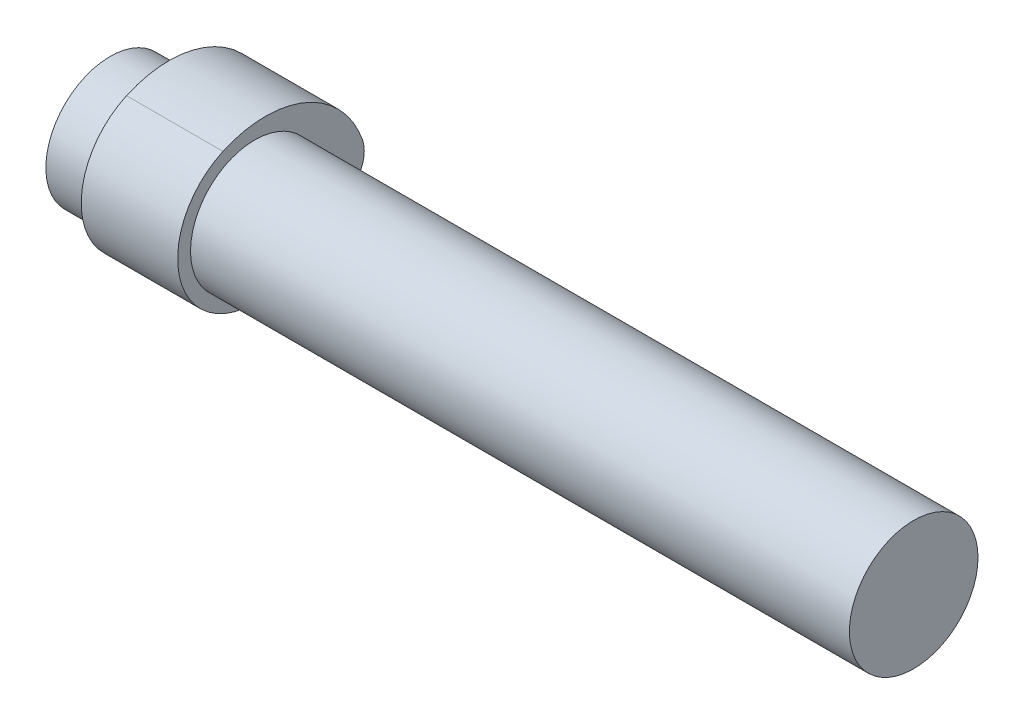
ISO-10303-21;
HEADER;
FILE_DESCRIPTION(('STEP AP214'),'2;1');
FILE_NAME('part.step','',(''),(''),'','','');
FILE_SCHEMA(('AUTOMOTIVE_DESIGN { 1 0 10303 214 1 1 1 1 }'));
ENDSEC;
DATA;
#1=APPLICATION_CONTEXT('core data for automotive mechanical design processes');
#2=APPLICATION_PROTOCOL_DEFINITION('international standard','automotive_design',2000,#1);
#3=PRODUCT_CONTEXT('',#1,'mechanical');
#4=PRODUCT('Part','Part','',(#3));
#5=PRODUCT_RELATED_PRODUCT_CATEGORY('part','',(#4));
#6=PRODUCT_DEFINITION_FORMATION('','',#4);
#7=PRODUCT_DEFINITION_CONTEXT('part definition',#1,'design');
#8=PRODUCT_DEFINITION('design','',#6,#7);
#9=PRODUCT_DEFINITION_SHAPE('','',#8);
#10=(LENGTH_UNIT() NAMED_UNIT(*) SI_UNIT(.MILLI.,.METRE.));
#11=(NAMED_UNIT(*) PLANE_ANGLE_UNIT() SI_UNIT($,.RADIAN.));
#12=(NAMED_UNIT(*) SI_UNIT($,.STERADIAN.) SOLID_ANGLE_UNIT());
#13=UNCERTAINTY_MEASURE_WITH_UNIT(LENGTH_MEASURE(1.E-05),#10,'distance_accuracy_value','');
#14=(GEOMETRIC_REPRESENTATION_CONTEXT(3) GLOBAL_UNCERTAINTY_ASSIGNED_CONTEXT((#13)) GLOBAL_UNIT_ASSIGNED_CONTEXT((#10,
#11,#12)) REPRESENTATION_CONTEXT('',''));
#15=CARTESIAN_POINT('',(0.,0.,0.));
#16=DIRECTION('',(0.,0.,1.));
#17=DIRECTION('',(1.,0.,0.));
#18=AXIS2_PLACEMENT_3D('',#15,#16,#17);
#19=CARTESIAN_POINT('',(0.,0.,0.));
#20=DIRECTION('',(1.,0.,0.));
#21=DIRECTION('',(0.,0.,-1.));
#22=AXIS2_PLACEMENT_3D('',#19,#20,#21);
#23=PLANE('',#22);
#24=CARTESIAN_POINT('',(0.,0.,0.));
#25=DIRECTION('',(1.,0.,0.));
#26=DIRECTION('',(0.,0.,-1.));
#27=AXIS2_PLACEMENT_3D('',#24,#25,#26);
#28=CIRCLE('',#27,10.);
#29=CARTESIAN_POINT('',(0.,0.,-10.));
#30=VERTEX_POINT('',#29);
#31=EDGE_CURVE('E11',#30,#30,#28,.F.);
#32=ORIENTED_EDGE('',*,*,#31,.T.);
#33=EDGE_LOOP('',(#32));
#34=FACE_BOUND('',#33,.T.);
#35=ADVANCED_FACE('F37',(#34),#23,.F.);
#36=CARTESIAN_POINT('',(-75.,0.,0.));
#37=DIRECTION('',(1.,0.,0.));
#38=DIRECTION('',(0.,0.,-1.));
#39=AXIS2_PLACEMENT_3D('',#36,#37,#38);
#40=CYLINDRICAL_SURFACE('',#39,10.);
#41=CARTESIAN_POINT('',(125.,0.,0.));
#42=DIRECTION('',(1.,0.,0.));
#43=DIRECTION('',(0.,0.,-1.));
#44=AXIS2_PLACEMENT_3D('',#41,#42,#43);
#45=CIRCLE('',#44,10.);
#46=CARTESIAN_POINT('',(125.,0.,-10.));
#47=VERTEX_POINT('',#46);
#48=EDGE_CURVE('E114',#47,#47,#45,.T.);
#49=ORIENTED_EDGE('',*,*,#48,.F.);
#50=EDGE_LOOP('',(#49));
#51=FACE_BOUND('',#50,.T.);
#52=CARTESIAN_POINT('',(22.5,0.,0.));
#53=DIRECTION('',(-1.,0.,0.));
#54=DIRECTION('',(0.,0.,1.));
#55=AXIS2_PLACEMENT_3D('',#52,#53,#54);
#56=CIRCLE('',#55,10.);
#57=CARTESIAN_POINT('',(22.5,0.,10.));
#58=VERTEX_POINT('',#57);
#59=EDGE_CURVE('E113',#58,#58,#56,.F.);
#60=ORIENTED_EDGE('',*,*,#59,.T.);
#61=EDGE_LOOP('',(#60));
#62=FACE_BOUND('',#61,.T.);
#63=ADVANCED_FACE('F121',(#51,#62),#40,.T.);
#64=CARTESIAN_POINT('',(125.,0.,0.));
#65=DIRECTION('',(1.,0.,0.));
#66=DIRECTION('',(0.,0.,-1.));
#67=AXIS2_PLACEMENT_3D('',#64,#65,#66);
#68=PLANE('',#67);
#69=ORIENTED_EDGE('',*,*,#48,.T.);
#70=EDGE_LOOP('',(#69));
#71=FACE_BOUND('',#70,.T.);
#72=ADVANCED_FACE('F140',(#71),#68,.T.);
#73=CARTESIAN_POINT('',(22.5,-3.64370686285011,-1.65027279490969));
#74=DIRECTION('',(-1.,0.,0.));
#75=DIRECTION('',(0.,0.,1.));
#76=AXIS2_PLACEMENT_3D('',#73,#74,#75);
#77=CYLINDRICAL_SURFACE('',#76,16.);
#78=CARTESIAN_POINT('',(7.5,-3.64370686285011,-1.65027279490969));
#79=DIRECTION('',(1.,0.,0.));
#80=DIRECTION('',(0.,0.,1.));
#81=AXIS2_PLACEMENT_3D('',#78,#79,#80);
#82=CIRCLE('',#81,16.);
#83=CARTESIAN_POINT('',(7.5,1.65623039220459,-16.7469832012361));
#84=VERTEX_POINT('',#83);
#85=CARTESIAN_POINT('',(7.5,10.9311205885503,4.95081838472907));
#86=VERTEX_POINT('',#85);
#87=EDGE_CURVE('E104',#84,#86,#82,.T.);
#88=ORIENTED_EDGE('',*,*,#87,.T.);
#89=DIRECTION('',(-1.,0.,0.));
#90=VECTOR('',#89,1.);
#91=CARTESIAN_POINT('',(22.5,10.9311205885503,4.95081838472907));
#92=LINE('',#91,#90);
#93=CARTESIAN_POINT('',(22.5,10.9311205885503,4.95081838472907));
#94=VERTEX_POINT('',#93);
#95=EDGE_CURVE('E95',#94,#86,#92,.T.);
#96=ORIENTED_EDGE('',*,*,#95,.F.);
#97=CARTESIAN_POINT('',(22.5,-3.64370686285011,-1.65027279490969));
#98=DIRECTION('',(1.,0.,0.));
#99=DIRECTION('',(0.,0.,1.));
#100=AXIS2_PLACEMENT_3D('',#97,#98,#99);
#101=CIRCLE('',#100,16.);
#102=CARTESIAN_POINT('',(22.5,1.65623039220459,-16.7469832012361));
#103=VERTEX_POINT('',#102);
#104=EDGE_CURVE('E89',#103,#94,#101,.T.);
#105=ORIENTED_EDGE('',*,*,#104,.F.);
#106=DIRECTION('',(-1.,0.,0.));
#107=VECTOR('',#106,1.);
#108=CARTESIAN_POINT('',(22.5,1.65623039220459,-16.7469832012361));
#109=LINE('',#108,#107);
#110=EDGE_CURVE('E100',#103,#84,#109,.T.);
#111=ORIENTED_EDGE('',*,*,#110,.T.);
#112=EDGE_LOOP('',(#88,#96,#105,#111));
#113=FACE_BOUND('',#112,.T.);
#114=ADVANCED_FACE('F151',(#113),#77,.T.);
#115=CARTESIAN_POINT('',(22.5,0.,0.));
#116=DIRECTION('',(-1.,0.,0.));
#117=DIRECTION('',(0.,0.,1.));
#118=AXIS2_PLACEMENT_3D('',#115,#116,#117);
#119=CYLINDRICAL_SURFACE('',#118,12.);
#120=CARTESIAN_POINT('',(7.5,0.,0.));
#121=DIRECTION('',(1.,0.,0.));
#122=DIRECTION('',(0.,0.,-1.));
#123=AXIS2_PLACEMENT_3D('',#120,#121,#122);
#124=CIRCLE('',#123,12.);
#125=CARTESIAN_POINT('',(7.5,-10.7768818790833,-5.27814522008306));
#126=VERTEX_POINT('',#125);
#127=EDGE_CURVE('E94',#86,#126,#124,.T.);
#128=ORIENTED_EDGE('',*,*,#127,.T.);
#129=DIRECTION('',(-1.,0.,0.));
#130=VECTOR('',#129,1.);
#131=CARTESIAN_POINT('',(22.5,-10.7768818790833,-5.27814522008306));
#132=LINE('',#131,#130);
#133=CARTESIAN_POINT('',(22.5,-10.7768818790833,-5.27814522008306));
#134=VERTEX_POINT('',#133);
#135=EDGE_CURVE('E92',#134,#126,#132,.T.);
#136=ORIENTED_EDGE('',*,*,#135,.F.);
#137=CARTESIAN_POINT('',(22.5,0.,0.));
#138=DIRECTION('',(1.,0.,0.));
#139=DIRECTION('',(0.,0.,-1.));
#140=AXIS2_PLACEMENT_3D('',#137,#138,#139);
#141=CIRCLE('',#140,12.);
#142=EDGE_CURVE('E84',#94,#134,#141,.T.);
#143=ORIENTED_EDGE('',*,*,#142,.F.);
#144=ORIENTED_EDGE('',*,*,#95,.T.);
#145=EDGE_LOOP('',(#128,#136,#143,#144));
#146=FACE_BOUND('',#145,.T.);
#147=ADVANCED_FACE('F93',(#146),#119,.T.);
#148=CARTESIAN_POINT('',(22.5,25.1460577178611,12.3156721801938));
#149=DIRECTION('',(-1.,0.,0.));
#150=DIRECTION('',(0.,0.,1.));
#151=AXIS2_PLACEMENT_3D('',#148,#149,#150);
#152=CYLINDRICAL_SURFACE('',#151,40.);
#153=CARTESIAN_POINT('',(7.5,25.1460577178611,12.3156721801938));
#154=DIRECTION('',(1.,0.,0.));
#155=DIRECTION('',(0.,0.,1.));
#156=AXIS2_PLACEMENT_3D('',#153,#154,#155);
#157=CIRCLE('',#156,40.);
#158=CARTESIAN_POINT('',(7.5,-3.59229395969443,-15.5071088248952));
#159=VERTEX_POINT('',#158);
#160=EDGE_CURVE('E70',#126,#159,#157,.T.);
#161=ORIENTED_EDGE('',*,*,#160,.T.);
#162=DIRECTION('',(-1.,0.,0.));
#163=VECTOR('',#162,1.);
#164=CARTESIAN_POINT('',(22.5,-3.59229395969443,-15.5071088248952));
#165=LINE('',#164,#163);
#166=CARTESIAN_POINT('',(22.5,-3.59229395969443,-15.5071088248952));
#167=VERTEX_POINT('',#166);
#168=EDGE_CURVE('E96',#167,#159,#165,.T.);
#169=ORIENTED_EDGE('',*,*,#168,.F.);
#170=CARTESIAN_POINT('',(22.5,25.1460577178611,12.3156721801938));
#171=DIRECTION('',(1.,0.,0.));
#172=DIRECTION('',(0.,0.,1.));
#173=AXIS2_PLACEMENT_3D('',#170,#171,#172);
#174=CIRCLE('',#173,40.);
#175=EDGE_CURVE('E87',#134,#167,#174,.T.);
#176=ORIENTED_EDGE('',*,*,#175,.F.);
#177=ORIENTED_EDGE('',*,*,#135,.T.);
#178=EDGE_LOOP('',(#161,#169,#176,#177));
#179=FACE_BOUND('',#178,.T.);
#180=ADVANCED_FACE('F98',(#179),#152,.T.);
#181=CARTESIAN_POINT('',(22.5,0.,-12.0292611992591));
#182=DIRECTION('',(-1.,0.,0.));
#183=DIRECTION('',(0.,0.,1.));
#184=AXIS2_PLACEMENT_3D('',#181,#182,#183);
#185=CYLINDRICAL_SURFACE('',#184,5.);
#186=CARTESIAN_POINT('',(7.5,0.,-12.0292611992591));
#187=DIRECTION('',(1.,0.,0.));
#188=DIRECTION('',(0.,0.,1.));
#189=AXIS2_PLACEMENT_3D('',#186,#187,#188);
#190=CIRCLE('',#189,5.);
#191=EDGE_CURVE('E76',#159,#84,#190,.T.);
#192=ORIENTED_EDGE('',*,*,#191,.T.);
#193=ORIENTED_EDGE('',*,*,#110,.F.);
#194=CARTESIAN_POINT('',(22.5,0.,-12.0292611992591));
#195=DIRECTION('',(1.,0.,0.));
#196=DIRECTION('',(0.,0.,1.));
#197=AXIS2_PLACEMENT_3D('',#194,#195,#196);
#198=CIRCLE('',#197,5.);
#199=EDGE_CURVE('E53',#167,#103,#198,.T.);
#200=ORIENTED_EDGE('',*,*,#199,.F.);
#201=ORIENTED_EDGE('',*,*,#168,.T.);
#202=EDGE_LOOP('',(#192,#193,#200,#201));
#203=FACE_BOUND('',#202,.T.);
#204=ADVANCED_FACE('F125',(#203),#185,.T.);
#205=CARTESIAN_POINT('',(22.5,-1.82185343142505,-6.83976699708438));
#206=DIRECTION('',(-1.,0.,0.));
#207=DIRECTION('',(0.,0.,1.));
#208=AXIS2_PLACEMENT_3D('',#205,#206,#207);
#209=PLANE('',#208);
#210=ORIENTED_EDGE('',*,*,#59,.F.);
#211=EDGE_LOOP('',(#210));
#212=FACE_BOUND('',#211,.T.);
#213=ORIENTED_EDGE('',*,*,#104,.T.);
#214=ORIENTED_EDGE('',*,*,#142,.T.);
#215=ORIENTED_EDGE('',*,*,#175,.T.);
#216=ORIENTED_EDGE('',*,*,#199,.T.);
#217=EDGE_LOOP('',(#213,#214,#215,#216));
#218=FACE_BOUND('',#217,.T.);
#219=ADVANCED_FACE('F85',(#212,#218),#209,.F.);
#220=CARTESIAN_POINT('',(7.5,-1.82185343142505,-6.83976699708438));
#221=DIRECTION('',(-1.,0.,0.));
#222=DIRECTION('',(0.,0.,1.));
#223=AXIS2_PLACEMENT_3D('',#220,#221,#222);
#224=PLANE('',#223);
#225=CARTESIAN_POINT('',(7.49999999999999,0.,0.));
#226=DIRECTION('',(-1.,0.,0.));
#227=DIRECTION('',(0.,0.,1.));
#228=AXIS2_PLACEMENT_3D('',#225,#226,#227);
#229=CIRCLE('',#228,10.);
#230=CARTESIAN_POINT('',(7.49999999999999,0.,10.));
#231=VERTEX_POINT('',#230);
#232=EDGE_CURVE('E45',#231,#231,#229,.F.);
#233=ORIENTED_EDGE('',*,*,#232,.T.);
#234=EDGE_LOOP('',(#233));
#235=FACE_BOUND('',#234,.T.);
#236=ORIENTED_EDGE('',*,*,#87,.F.);
#237=ORIENTED_EDGE('',*,*,#191,.F.);
#238=ORIENTED_EDGE('',*,*,#160,.F.);
#239=ORIENTED_EDGE('',*,*,#127,.F.);
#240=EDGE_LOOP('',(#236,#237,#238,#239));
#241=FACE_BOUND('',#240,.T.);
#242=ADVANCED_FACE('F124',(#235,#241),#224,.T.);
#243=ORIENTED_EDGE('',*,*,#31,.F.);
#244=EDGE_LOOP('',(#243));
#245=FACE_BOUND('',#244,.T.);
#246=ORIENTED_EDGE('',*,*,#232,.F.);
#247=EDGE_LOOP('',(#246));
#248=FACE_BOUND('',#247,.T.);
#249=ADVANCED_FACE('F131',(#245,#248),#40,.T.);
#250=CLOSED_SHELL('',(#35,#63,#72,#114,#147,#180,#204,#219,#242,#249));
#251=MANIFOLD_SOLID_BREP('B2',#250);
#252=ADVANCED_BREP_SHAPE_REPRESENTATION('',(#18,#251),#14);
#253=SHAPE_DEFINITION_REPRESENTATION(#9,#252);
ENDSEC;
END-ISO-10303-21;
